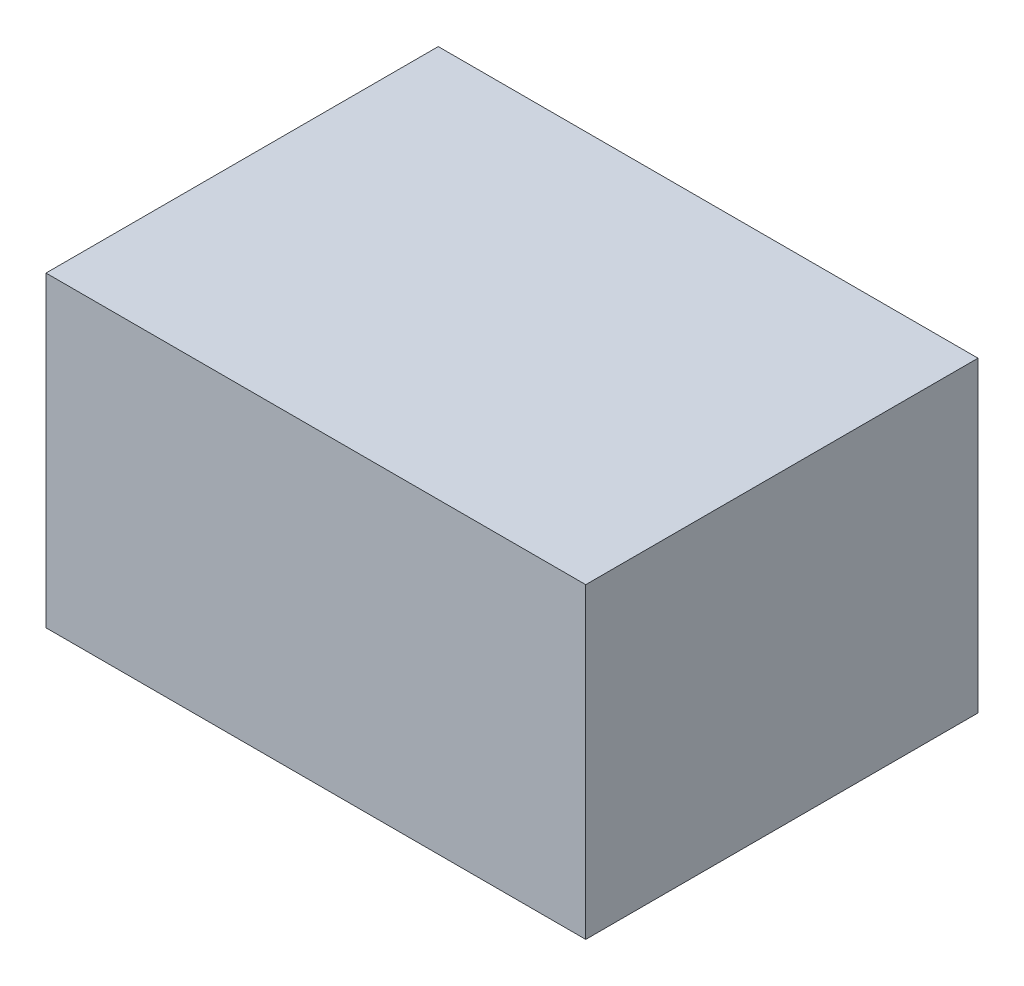
ISO-10303-21;
HEADER;
FILE_DESCRIPTION(('STEP AP214'),'2;1');
FILE_NAME('part.step','',(''),(''),'','','');
FILE_SCHEMA(('AUTOMOTIVE_DESIGN { 1 0 10303 214 1 1 1 1 }'));
ENDSEC;
DATA;
#1=APPLICATION_CONTEXT('core data for automotive mechanical design processes');
#2=APPLICATION_PROTOCOL_DEFINITION('international standard','automotive_design',2000,#1);
#3=PRODUCT_CONTEXT('',#1,'mechanical');
#4=PRODUCT('Part','Part','',(#3));
#5=PRODUCT_RELATED_PRODUCT_CATEGORY('part','',(#4));
#6=PRODUCT_DEFINITION_FORMATION('','',#4);
#7=PRODUCT_DEFINITION_CONTEXT('part definition',#1,'design');
#8=PRODUCT_DEFINITION('design','',#6,#7);
#9=PRODUCT_DEFINITION_SHAPE('','',#8);
#10=(LENGTH_UNIT() NAMED_UNIT(*) SI_UNIT(.MILLI.,.METRE.));
#11=(NAMED_UNIT(*) PLANE_ANGLE_UNIT() SI_UNIT($,.RADIAN.));
#12=(NAMED_UNIT(*) SI_UNIT($,.STERADIAN.) SOLID_ANGLE_UNIT());
#13=UNCERTAINTY_MEASURE_WITH_UNIT(LENGTH_MEASURE(1.E-05),#10,'distance_accuracy_value','');
#14=(GEOMETRIC_REPRESENTATION_CONTEXT(3) GLOBAL_UNCERTAINTY_ASSIGNED_CONTEXT((#13)) GLOBAL_UNIT_ASSIGNED_CONTEXT((#10,
#11,#12)) REPRESENTATION_CONTEXT('',''));
#15=CARTESIAN_POINT('',(0.,0.,0.));
#16=DIRECTION('',(0.,0.,1.));
#17=DIRECTION('',(1.,0.,0.));
#18=AXIS2_PLACEMENT_3D('',#15,#16,#17);
#19=CARTESIAN_POINT('',(26.35,-15.,38.3));
#20=DIRECTION('',(-1.,0.,0.));
#21=DIRECTION('',(0.,0.,1.));
#22=AXIS2_PLACEMENT_3D('',#19,#20,#21);
#23=PLANE('',#22);
#24=DIRECTION('',(0.,1.,0.));
#25=VECTOR('',#24,1.);
#26=CARTESIAN_POINT('',(26.35,-15.,0.));
#27=LINE('',#26,#25);
#28=CARTESIAN_POINT('',(26.35,-15.,0.));
#29=VERTEX_POINT('',#28);
#30=CARTESIAN_POINT('',(26.35,15.,0.));
#31=VERTEX_POINT('',#30);
#32=EDGE_CURVE('E102',#29,#31,#27,.T.);
#33=ORIENTED_EDGE('',*,*,#32,.T.);
#34=DIRECTION('',(0.,0.,-1.));
#35=VECTOR('',#34,1.);
#36=CARTESIAN_POINT('',(26.35,15.,38.3));
#37=LINE('',#36,#35);
#38=CARTESIAN_POINT('',(26.35,15.,38.3));
#39=VERTEX_POINT('',#38);
#40=EDGE_CURVE('E11',#39,#31,#37,.T.);
#41=ORIENTED_EDGE('',*,*,#40,.F.);
#42=DIRECTION('',(0.,1.,0.));
#43=VECTOR('',#42,1.);
#44=CARTESIAN_POINT('',(26.35,-15.,38.3));
#45=LINE('',#44,#43);
#46=CARTESIAN_POINT('',(26.35,-15.,38.3));
#47=VERTEX_POINT('',#46);
#48=EDGE_CURVE('E90',#47,#39,#45,.T.);
#49=ORIENTED_EDGE('',*,*,#48,.F.);
#50=DIRECTION('',(0.,0.,-1.));
#51=VECTOR('',#50,1.);
#52=CARTESIAN_POINT('',(26.35,-15.,38.3));
#53=LINE('',#52,#51);
#54=EDGE_CURVE('E98',#47,#29,#53,.T.);
#55=ORIENTED_EDGE('',*,*,#54,.T.);
#56=EDGE_LOOP('',(#33,#41,#49,#55));
#57=FACE_BOUND('',#56,.T.);
#58=ADVANCED_FACE('F39',(#57),#23,.F.);
#59=CARTESIAN_POINT('',(-26.35,15.,38.3));
#60=DIRECTION('',(0.,-1.,0.));
#61=DIRECTION('',(0.,0.,-1.));
#62=AXIS2_PLACEMENT_3D('',#59,#60,#61);
#63=PLANE('',#62);
#64=DIRECTION('',(-1.,0.,0.));
#65=VECTOR('',#64,1.);
#66=CARTESIAN_POINT('',(-26.35,15.,0.));
#67=LINE('',#66,#65);
#68=CARTESIAN_POINT('',(-26.35,15.,0.));
#69=VERTEX_POINT('',#68);
#70=EDGE_CURVE('E94',#31,#69,#67,.T.);
#71=ORIENTED_EDGE('',*,*,#70,.T.);
#72=DIRECTION('',(0.,0.,-1.));
#73=VECTOR('',#72,1.);
#74=CARTESIAN_POINT('',(-26.35,15.,38.3));
#75=LINE('',#74,#73);
#76=CARTESIAN_POINT('',(-26.35,15.,38.3));
#77=VERTEX_POINT('',#76);
#78=EDGE_CURVE('E47',#77,#69,#75,.T.);
#79=ORIENTED_EDGE('',*,*,#78,.F.);
#80=DIRECTION('',(-1.,0.,0.));
#81=VECTOR('',#80,1.);
#82=CARTESIAN_POINT('',(-26.35,15.,38.3));
#83=LINE('',#82,#81);
#84=EDGE_CURVE('E85',#39,#77,#83,.T.);
#85=ORIENTED_EDGE('',*,*,#84,.F.);
#86=ORIENTED_EDGE('',*,*,#40,.T.);
#87=EDGE_LOOP('',(#71,#79,#85,#86));
#88=FACE_BOUND('',#87,.T.);
#89=ADVANCED_FACE('F93',(#88),#63,.F.);
#90=CARTESIAN_POINT('',(-26.35,-15.,38.3));
#91=DIRECTION('',(1.,0.,0.));
#92=DIRECTION('',(0.,0.,-1.));
#93=AXIS2_PLACEMENT_3D('',#90,#91,#92);
#94=PLANE('',#93);
#95=DIRECTION('',(0.,-1.,0.));
#96=VECTOR('',#95,1.);
#97=CARTESIAN_POINT('',(-26.35,-15.,0.));
#98=LINE('',#97,#96);
#99=CARTESIAN_POINT('',(-26.35,-15.,0.));
#100=VERTEX_POINT('',#99);
#101=EDGE_CURVE('E72',#69,#100,#98,.T.);
#102=ORIENTED_EDGE('',*,*,#101,.T.);
#103=DIRECTION('',(0.,0.,-1.));
#104=VECTOR('',#103,1.);
#105=CARTESIAN_POINT('',(-26.35,-15.,38.3));
#106=LINE('',#105,#104);
#107=CARTESIAN_POINT('',(-26.35,-15.,38.3));
#108=VERTEX_POINT('',#107);
#109=EDGE_CURVE('E95',#108,#100,#106,.T.);
#110=ORIENTED_EDGE('',*,*,#109,.F.);
#111=DIRECTION('',(0.,-1.,0.));
#112=VECTOR('',#111,1.);
#113=CARTESIAN_POINT('',(-26.35,-15.,38.3));
#114=LINE('',#113,#112);
#115=EDGE_CURVE('E88',#77,#108,#114,.T.);
#116=ORIENTED_EDGE('',*,*,#115,.F.);
#117=ORIENTED_EDGE('',*,*,#78,.T.);
#118=EDGE_LOOP('',(#102,#110,#116,#117));
#119=FACE_BOUND('',#118,.T.);
#120=ADVANCED_FACE('F96',(#119),#94,.F.);
#121=CARTESIAN_POINT('',(-26.35,-15.,38.3));
#122=DIRECTION('',(0.,1.,0.));
#123=DIRECTION('',(0.,0.,1.));
#124=AXIS2_PLACEMENT_3D('',#121,#122,#123);
#125=PLANE('',#124);
#126=DIRECTION('',(1.,0.,0.));
#127=VECTOR('',#126,1.);
#128=CARTESIAN_POINT('',(-26.35,-15.,0.));
#129=LINE('',#128,#127);
#130=EDGE_CURVE('E78',#100,#29,#129,.T.);
#131=ORIENTED_EDGE('',*,*,#130,.T.);
#132=ORIENTED_EDGE('',*,*,#54,.F.);
#133=DIRECTION('',(1.,0.,0.));
#134=VECTOR('',#133,1.);
#135=CARTESIAN_POINT('',(-26.35,-15.,38.3));
#136=LINE('',#135,#134);
#137=EDGE_CURVE('E55',#108,#47,#136,.T.);
#138=ORIENTED_EDGE('',*,*,#137,.F.);
#139=ORIENTED_EDGE('',*,*,#109,.T.);
#140=EDGE_LOOP('',(#131,#132,#138,#139));
#141=FACE_BOUND('',#140,.T.);
#142=ADVANCED_FACE('F109',(#141),#125,.F.);
#143=CARTESIAN_POINT('',(0.,0.,38.3));
#144=DIRECTION('',(0.,0.,-1.));
#145=DIRECTION('',(-1.,0.,0.));
#146=AXIS2_PLACEMENT_3D('',#143,#144,#145);
#147=PLANE('',#146);
#148=ORIENTED_EDGE('',*,*,#48,.T.);
#149=ORIENTED_EDGE('',*,*,#84,.T.);
#150=ORIENTED_EDGE('',*,*,#115,.T.);
#151=ORIENTED_EDGE('',*,*,#137,.T.);
#152=EDGE_LOOP('',(#148,#149,#150,#151));
#153=FACE_BOUND('',#152,.T.);
#154=ADVANCED_FACE('F86',(#153),#147,.F.);
#155=CARTESIAN_POINT('',(0.,0.,0.));
#156=DIRECTION('',(0.,0.,-1.));
#157=DIRECTION('',(-1.,0.,0.));
#158=AXIS2_PLACEMENT_3D('',#155,#156,#157);
#159=PLANE('',#158);
#160=ORIENTED_EDGE('',*,*,#32,.F.);
#161=ORIENTED_EDGE('',*,*,#130,.F.);
#162=ORIENTED_EDGE('',*,*,#101,.F.);
#163=ORIENTED_EDGE('',*,*,#70,.F.);
#164=EDGE_LOOP('',(#160,#161,#162,#163));
#165=FACE_BOUND('',#164,.T.);
#166=ADVANCED_FACE('F112',(#165),#159,.T.);
#167=CLOSED_SHELL('',(#58,#89,#120,#142,#154,#166));
#168=MANIFOLD_SOLID_BREP('B2',#167);
#169=ADVANCED_BREP_SHAPE_REPRESENTATION('',(#18,#168),#14);
#170=SHAPE_DEFINITION_REPRESENTATION(#9,#169);
ENDSEC;
END-ISO-10303-21;
